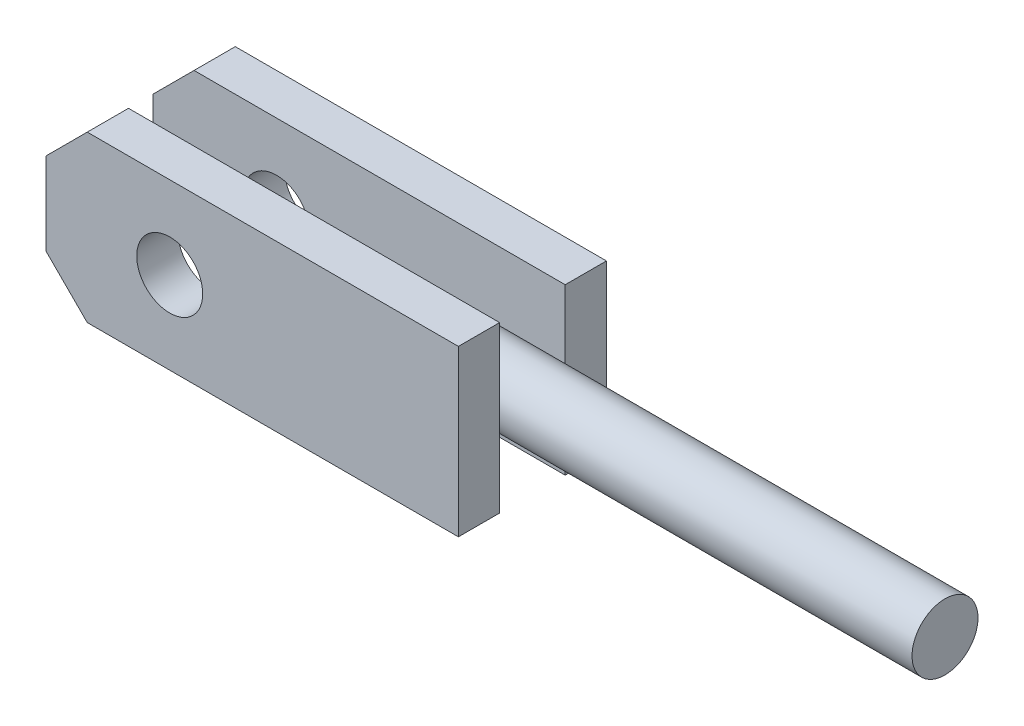
ISO-10303-21;
HEADER;
FILE_DESCRIPTION(('STEP AP214'),'2;1');
FILE_NAME('part.step','',(''),(''),'','','');
FILE_SCHEMA(('AUTOMOTIVE_DESIGN { 1 0 10303 214 1 1 1 1 }'));
ENDSEC;
DATA;
#1=APPLICATION_CONTEXT('core data for automotive mechanical design processes');
#2=APPLICATION_PROTOCOL_DEFINITION('international standard','automotive_design',2000,#1);
#3=PRODUCT_CONTEXT('',#1,'mechanical');
#4=PRODUCT('Part','Part','',(#3));
#5=PRODUCT_RELATED_PRODUCT_CATEGORY('part','',(#4));
#6=PRODUCT_DEFINITION_FORMATION('','',#4);
#7=PRODUCT_DEFINITION_CONTEXT('part definition',#1,'design');
#8=PRODUCT_DEFINITION('design','',#6,#7);
#9=PRODUCT_DEFINITION_SHAPE('','',#8);
#10=(LENGTH_UNIT() NAMED_UNIT(*) SI_UNIT(.MILLI.,.METRE.));
#11=(NAMED_UNIT(*) PLANE_ANGLE_UNIT() SI_UNIT($,.RADIAN.));
#12=(NAMED_UNIT(*) SI_UNIT($,.STERADIAN.) SOLID_ANGLE_UNIT());
#13=UNCERTAINTY_MEASURE_WITH_UNIT(LENGTH_MEASURE(1.E-05),#10,'distance_accuracy_value','');
#14=(GEOMETRIC_REPRESENTATION_CONTEXT(3) GLOBAL_UNCERTAINTY_ASSIGNED_CONTEXT((#13)) GLOBAL_UNIT_ASSIGNED_CONTEXT((#10,
#11,#12)) REPRESENTATION_CONTEXT('',''));
#15=CARTESIAN_POINT('',(0.,0.,0.));
#16=DIRECTION('',(0.,0.,1.));
#17=DIRECTION('',(1.,0.,0.));
#18=AXIS2_PLACEMENT_3D('',#15,#16,#17);
#19=CARTESIAN_POINT('',(30.0000000000008,-8.88178419700125E-13,-8.00000000000045));
#20=DIRECTION('',(1.,0.,0.));
#21=DIRECTION('',(0.,0.,-1.));
#22=AXIS2_PLACEMENT_3D('',#19,#20,#21);
#23=CYLINDRICAL_SURFACE('',#22,8.);
#24=DIRECTION('',(1.,0.,0.));
#25=VECTOR('',#24,1.);
#26=CARTESIAN_POINT('',(29.9999999999998,-1.26095202129184,-15.9000000000005));
#27=LINE('',#26,#25);
#28=CARTESIAN_POINT('',(50.0000000000002,-1.26095202129184,-15.9));
#29=VERTEX_POINT('',#28);
#30=CARTESIAN_POINT('',(29.9999999999998,-1.26095202129184,-15.9000000000005));
#31=VERTEX_POINT('',#30);
#32=EDGE_CURVE('E153',#29,#31,#27,.F.);
#33=ORIENTED_EDGE('',*,*,#32,.F.);
#34=CARTESIAN_POINT('',(50.0000000000003,4.44089209850063E-13,-7.9999999999999));
#35=DIRECTION('',(-1.,0.,0.));
#36=DIRECTION('',(0.,0.,1.));
#37=AXIS2_PLACEMENT_3D('',#34,#35,#36);
#38=CIRCLE('',#37,8.);
#39=CARTESIAN_POINT('',(49.9999999999994,1.26095202129006,-15.8999999999999));
#40=VERTEX_POINT('',#39);
#41=EDGE_CURVE('E134',#29,#40,#38,.F.);
#42=ORIENTED_EDGE('',*,*,#41,.T.);
#43=DIRECTION('',(1.,0.,0.));
#44=VECTOR('',#43,1.);
#45=CARTESIAN_POINT('',(29.9999999999993,1.26095202129184,-15.9000000000005));
#46=LINE('',#45,#44);
#47=CARTESIAN_POINT('',(29.9999999999993,1.26095202129184,-15.9000000000005));
#48=VERTEX_POINT('',#47);
#49=EDGE_CURVE('E128',#48,#40,#46,.T.);
#50=ORIENTED_EDGE('',*,*,#49,.F.);
#51=CARTESIAN_POINT('',(30.0000000000008,-8.88178419700125E-13,-8.00000000000045));
#52=DIRECTION('',(1.,0.,0.));
#53=DIRECTION('',(0.,0.,-1.));
#54=AXIS2_PLACEMENT_3D('',#51,#52,#53);
#55=CIRCLE('',#54,8.);
#56=EDGE_CURVE('E158',#48,#31,#55,.T.);
#57=ORIENTED_EDGE('',*,*,#56,.T.);
#58=EDGE_LOOP('',(#33,#42,#50,#57));
#59=FACE_BOUND('',#58,.T.);
#60=CARTESIAN_POINT('',(149.999999999998,-3.10862446895044E-12,-8.00000000000045));
#61=DIRECTION('',(1.,0.,0.));
#62=DIRECTION('',(0.,0.,-1.));
#63=AXIS2_PLACEMENT_3D('',#60,#61,#62);
#64=CIRCLE('',#63,8.);
#65=CARTESIAN_POINT('',(149.999999999998,-3.1141131260501E-12,-16.0000000000005));
#66=VERTEX_POINT('',#65);
#67=EDGE_CURVE('E155',#66,#66,#64,.T.);
#68=ORIENTED_EDGE('',*,*,#67,.F.);
#69=EDGE_LOOP('',(#68));
#70=FACE_BOUND('',#69,.T.);
#71=ADVANCED_FACE('F44',(#59,#70),#23,.T.);
#72=CARTESIAN_POINT('',(30.0000000000008,-8.88178419700125E-13,-8.00000000000045));
#73=DIRECTION('',(1.,0.,0.));
#74=DIRECTION('',(0.,0.,-1.));
#75=AXIS2_PLACEMENT_3D('',#72,#73,#74);
#76=PLANE('',#75);
#77=ORIENTED_EDGE('',*,*,#56,.F.);
#78=DIRECTION('',(0.,-1.,0.));
#79=VECTOR('',#78,1.);
#80=CARTESIAN_POINT('',(30.0000000000016,-4.44089209850063E-13,-15.9000000000005));
#81=LINE('',#80,#79);
#82=EDGE_CURVE('E161',#48,#31,#81,.T.);
#83=ORIENTED_EDGE('',*,*,#82,.T.);
#84=EDGE_LOOP('',(#77,#83));
#85=FACE_BOUND('',#84,.T.);
#86=ADVANCED_FACE('F208',(#85),#76,.F.);
#87=CARTESIAN_POINT('',(149.999999999998,-3.10862446895044E-12,-8.00000000000045));
#88=DIRECTION('',(1.,0.,0.));
#89=DIRECTION('',(0.,0.,-1.));
#90=AXIS2_PLACEMENT_3D('',#87,#88,#89);
#91=PLANE('',#90);
#92=ORIENTED_EDGE('',*,*,#67,.T.);
#93=EDGE_LOOP('',(#92));
#94=FACE_BOUND('',#93,.T.);
#95=ADVANCED_FACE('F214',(#94),#91,.T.);
#96=CARTESIAN_POINT('',(-49.9999999999989,-20.,-15.9000000000008));
#97=DIRECTION('',(1.,0.,0.));
#98=DIRECTION('',(0.,1.,0.));
#99=AXIS2_PLACEMENT_3D('',#96,#97,#98);
#100=PLANE('',#99);
#101=DIRECTION('',(0.,-1.,0.));
#102=VECTOR('',#101,1.);
#103=CARTESIAN_POINT('',(-50.0000000000003,-20.0000000000014,-25.9000000000008));
#104=LINE('',#103,#102);
#105=CARTESIAN_POINT('',(-49.9999999999995,9.99999999999801,-25.9000000000007));
#106=VERTEX_POINT('',#105);
#107=CARTESIAN_POINT('',(-49.9999999999998,-9.99999999999979,-25.9000000000005));
#108=VERTEX_POINT('',#107);
#109=EDGE_CURVE('E141',#106,#108,#104,.T.);
#110=ORIENTED_EDGE('',*,*,#109,.T.);
#111=DIRECTION('',(0.,0.,1.));
#112=VECTOR('',#111,1.);
#113=CARTESIAN_POINT('',(-49.9999999999998,-10.0000000000011,-15.9000000000005));
#114=LINE('',#113,#112);
#115=CARTESIAN_POINT('',(-49.9999999999998,-10.0000000000011,-15.9000000000005));
#116=VERTEX_POINT('',#115);
#117=EDGE_CURVE('E52',#108,#116,#114,.T.);
#118=ORIENTED_EDGE('',*,*,#117,.T.);
#119=DIRECTION('',(0.,-1.,0.));
#120=VECTOR('',#119,1.);
#121=CARTESIAN_POINT('',(-49.9999999999989,-20.,-15.9000000000008));
#122=LINE('',#121,#120);
#123=CARTESIAN_POINT('',(-50.0000000000012,9.99999999999934,-15.9000000000007));
#124=VERTEX_POINT('',#123);
#125=EDGE_CURVE('E120',#124,#116,#122,.T.);
#126=ORIENTED_EDGE('',*,*,#125,.F.);
#127=DIRECTION('',(0.,0.,-1.));
#128=VECTOR('',#127,1.);
#129=CARTESIAN_POINT('',(-50.0000000000012,9.99999999999934,-15.9000000000007));
#130=LINE('',#129,#128);
#131=EDGE_CURVE('E165',#124,#106,#130,.T.);
#132=ORIENTED_EDGE('',*,*,#131,.T.);
#133=EDGE_LOOP('',(#110,#118,#126,#132));
#134=FACE_BOUND('',#133,.T.);
#135=ADVANCED_FACE('F188',(#134),#100,.F.);
#136=CARTESIAN_POINT('',(50.0000000000003,-20.0000000000009,-15.9000000000004));
#137=DIRECTION('',(0.,1.,0.));
#138=DIRECTION('',(-1.,0.,0.));
#139=AXIS2_PLACEMENT_3D('',#136,#137,#138);
#140=PLANE('',#139);
#141=DIRECTION('',(1.,0.,0.));
#142=VECTOR('',#141,1.);
#143=CARTESIAN_POINT('',(50.0000000000003,-20.0000000000009,-15.9000000000004));
#144=LINE('',#143,#142);
#145=CARTESIAN_POINT('',(-40.0000000000014,-20.0000000000018,-15.9000000000005));
#146=VERTEX_POINT('',#145);
#147=CARTESIAN_POINT('',(50.0000000000003,-20.0000000000009,-15.9000000000004));
#148=VERTEX_POINT('',#147);
#149=EDGE_CURVE('E109',#146,#148,#144,.T.);
#150=ORIENTED_EDGE('',*,*,#149,.F.);
#151=DIRECTION('',(0.,0.,-1.));
#152=VECTOR('',#151,1.);
#153=CARTESIAN_POINT('',(-40.0000000000014,-20.0000000000018,-15.9000000000005));
#154=LINE('',#153,#152);
#155=CARTESIAN_POINT('',(-40.0000000000005,-20.0000000000031,-25.9000000000005));
#156=VERTEX_POINT('',#155);
#157=EDGE_CURVE('E174',#146,#156,#154,.T.);
#158=ORIENTED_EDGE('',*,*,#157,.T.);
#159=DIRECTION('',(1.,0.,0.));
#160=VECTOR('',#159,1.);
#161=CARTESIAN_POINT('',(50.0000000000003,-20.0000000000009,-25.9000000000004));
#162=LINE('',#161,#160);
#163=CARTESIAN_POINT('',(50.0000000000003,-20.0000000000009,-25.9000000000004));
#164=VERTEX_POINT('',#163);
#165=EDGE_CURVE('E125',#156,#164,#162,.T.);
#166=ORIENTED_EDGE('',*,*,#165,.T.);
#167=DIRECTION('',(0.,0.,-1.));
#168=VECTOR('',#167,1.);
#169=CARTESIAN_POINT('',(50.0000000000003,-20.0000000000009,-15.9000000000004));
#170=LINE('',#169,#168);
#171=EDGE_CURVE('E123',#148,#164,#170,.T.);
#172=ORIENTED_EDGE('',*,*,#171,.F.);
#173=EDGE_LOOP('',(#150,#158,#166,#172));
#174=FACE_BOUND('',#173,.T.);
#175=ADVANCED_FACE('F124',(#174),#140,.F.);
#176=CARTESIAN_POINT('',(50.0000000000003,-20.0000000000009,-15.9000000000004));
#177=DIRECTION('',(-1.,0.,0.));
#178=DIRECTION('',(0.,0.,1.));
#179=AXIS2_PLACEMENT_3D('',#176,#177,#178);
#180=PLANE('',#179);
#181=ORIENTED_EDGE('',*,*,#41,.F.);
#182=DIRECTION('',(0.,1.,0.));
#183=VECTOR('',#182,1.);
#184=CARTESIAN_POINT('',(50.0000000000003,-20.0000000000009,-15.9000000000004));
#185=LINE('',#184,#183);
#186=EDGE_CURVE('E113',#148,#29,#185,.T.);
#187=ORIENTED_EDGE('',*,*,#186,.F.);
#188=ORIENTED_EDGE('',*,*,#171,.T.);
#189=DIRECTION('',(0.,1.,0.));
#190=VECTOR('',#189,1.);
#191=CARTESIAN_POINT('',(50.0000000000003,-20.0000000000009,-25.9000000000004));
#192=LINE('',#191,#190);
#193=CARTESIAN_POINT('',(49.9999999999994,19.9999999999991,-25.9000000000001));
#194=VERTEX_POINT('',#193);
#195=EDGE_CURVE('E145',#164,#194,#192,.T.);
#196=ORIENTED_EDGE('',*,*,#195,.T.);
#197=DIRECTION('',(0.,0.,-1.));
#198=VECTOR('',#197,1.);
#199=CARTESIAN_POINT('',(49.9999999999997,19.9999999999991,-15.9000000000001));
#200=LINE('',#199,#198);
#201=CARTESIAN_POINT('',(49.9999999999997,19.9999999999991,-15.9000000000001));
#202=VERTEX_POINT('',#201);
#203=EDGE_CURVE('E129',#202,#194,#200,.T.);
#204=ORIENTED_EDGE('',*,*,#203,.F.);
#205=EDGE_CURVE('E119',#40,#202,#185,.T.);
#206=ORIENTED_EDGE('',*,*,#205,.F.);
#207=EDGE_LOOP('',(#181,#187,#188,#196,#204,#206));
#208=FACE_BOUND('',#207,.T.);
#209=ADVANCED_FACE('F131',(#208),#180,.F.);
#210=CARTESIAN_POINT('',(49.9999999999997,19.9999999999991,-15.9000000000001));
#211=DIRECTION('',(0.,-1.,0.));
#212=DIRECTION('',(1.,0.,0.));
#213=AXIS2_PLACEMENT_3D('',#210,#211,#212);
#214=PLANE('',#213);
#215=DIRECTION('',(-1.,0.,0.));
#216=VECTOR('',#215,1.);
#217=CARTESIAN_POINT('',(49.9999999999994,19.9999999999991,-25.9000000000001));
#218=LINE('',#217,#216);
#219=CARTESIAN_POINT('',(-40.0000000000009,20.,-25.9000000000007));
#220=VERTEX_POINT('',#219);
#221=EDGE_CURVE('E147',#194,#220,#218,.T.);
#222=ORIENTED_EDGE('',*,*,#221,.T.);
#223=DIRECTION('',(0.,0.,1.));
#224=VECTOR('',#223,1.);
#225=CARTESIAN_POINT('',(-40.0000000000005,19.9999999999991,-15.9000000000007));
#226=LINE('',#225,#224);
#227=CARTESIAN_POINT('',(-40.0000000000005,19.9999999999991,-15.9000000000007));
#228=VERTEX_POINT('',#227);
#229=EDGE_CURVE('E170',#220,#228,#226,.T.);
#230=ORIENTED_EDGE('',*,*,#229,.T.);
#231=DIRECTION('',(-1.,0.,0.));
#232=VECTOR('',#231,1.);
#233=CARTESIAN_POINT('',(49.9999999999997,19.9999999999991,-15.9000000000001));
#234=LINE('',#233,#232);
#235=EDGE_CURVE('E135',#202,#228,#234,.T.);
#236=ORIENTED_EDGE('',*,*,#235,.F.);
#237=ORIENTED_EDGE('',*,*,#203,.T.);
#238=EDGE_LOOP('',(#222,#230,#236,#237));
#239=FACE_BOUND('',#238,.T.);
#240=ADVANCED_FACE('F182',(#239),#214,.F.);
#241=CARTESIAN_POINT('',(0.,0.,-15.9));
#242=DIRECTION('',(0.,0.,1.));
#243=DIRECTION('',(1.,0.,0.));
#244=AXIS2_PLACEMENT_3D('',#241,#242,#243);
#245=PLANE('',#244);
#246=CARTESIAN_POINT('',(-20.0000000000001,-1.77635683940025E-12,-15.9));
#247=DIRECTION('',(0.,0.,1.));
#248=DIRECTION('',(1.,0.,0.));
#249=AXIS2_PLACEMENT_3D('',#246,#247,#248);
#250=CIRCLE('',#249,8.);
#251=CARTESIAN_POINT('',(-12.0000000000001,-1.7768009286101E-12,-15.9));
#252=VERTEX_POINT('',#251);
#253=EDGE_CURVE('E143',#252,#252,#250,.T.);
#254=ORIENTED_EDGE('',*,*,#253,.F.);
#255=EDGE_LOOP('',(#254));
#256=FACE_BOUND('',#255,.T.);
#257=ORIENTED_EDGE('',*,*,#125,.T.);
#258=DIRECTION('',(-0.707106781186548,0.707106781186552,0.));
#259=VECTOR('',#258,1.);
#260=CARTESIAN_POINT('',(-29.9999999999998,-29.9999999999994,-15.9000000000008));
#261=LINE('',#260,#259);
#262=EDGE_CURVE('E12',#116,#146,#261,.F.);
#263=ORIENTED_EDGE('',*,*,#262,.T.);
#264=ORIENTED_EDGE('',*,*,#149,.T.);
#265=ORIENTED_EDGE('',*,*,#186,.T.);
#266=ORIENTED_EDGE('',*,*,#32,.T.);
#267=ORIENTED_EDGE('',*,*,#82,.F.);
#268=ORIENTED_EDGE('',*,*,#49,.T.);
#269=ORIENTED_EDGE('',*,*,#205,.T.);
#270=ORIENTED_EDGE('',*,*,#235,.T.);
#271=DIRECTION('',(0.707106781186549,0.707106781186549,0.));
#272=VECTOR('',#271,1.);
#273=CARTESIAN_POINT('',(-30.0000000000007,29.9999999999994,-15.9000000000009));
#274=LINE('',#273,#272);
#275=EDGE_CURVE('E172',#228,#124,#274,.F.);
#276=ORIENTED_EDGE('',*,*,#275,.T.);
#277=EDGE_LOOP('',(#257,#263,#264,#265,#266,#267,#268,#269,#270,#276));
#278=FACE_BOUND('',#277,.T.);
#279=ADVANCED_FACE('F111',(#256,#278),#245,.T.);
#280=CARTESIAN_POINT('',(4.44089209850063E-13,8.88178419700125E-13,-25.9));
#281=DIRECTION('',(0.,0.,1.));
#282=DIRECTION('',(1.,0.,0.));
#283=AXIS2_PLACEMENT_3D('',#280,#281,#282);
#284=PLANE('',#283);
#285=CARTESIAN_POINT('',(-19.9999999999987,-8.88178419700125E-13,-25.9));
#286=DIRECTION('',(0.,0.,-1.));
#287=DIRECTION('',(-1.,0.,0.));
#288=AXIS2_PLACEMENT_3D('',#285,#286,#287);
#289=CIRCLE('',#288,8.);
#290=CARTESIAN_POINT('',(-27.9999999999987,-8.87734330490275E-13,-25.9));
#291=VERTEX_POINT('',#290);
#292=EDGE_CURVE('E192',#291,#291,#289,.T.);
#293=ORIENTED_EDGE('',*,*,#292,.F.);
#294=EDGE_LOOP('',(#293));
#295=FACE_BOUND('',#294,.T.);
#296=ORIENTED_EDGE('',*,*,#165,.F.);
#297=DIRECTION('',(0.707106781186548,-0.707106781186552,0.));
#298=VECTOR('',#297,1.);
#299=CARTESIAN_POINT('',(-40.0000000000005,-20.0000000000031,-25.9000000000005));
#300=LINE('',#299,#298);
#301=EDGE_CURVE('E66',#156,#108,#300,.F.);
#302=ORIENTED_EDGE('',*,*,#301,.T.);
#303=ORIENTED_EDGE('',*,*,#109,.F.);
#304=DIRECTION('',(-0.707106781186549,-0.707106781186549,0.));
#305=VECTOR('',#304,1.);
#306=CARTESIAN_POINT('',(-49.9999999999995,9.99999999999801,-25.9000000000007));
#307=LINE('',#306,#305);
#308=EDGE_CURVE('E168',#106,#220,#307,.F.);
#309=ORIENTED_EDGE('',*,*,#308,.T.);
#310=ORIENTED_EDGE('',*,*,#221,.F.);
#311=ORIENTED_EDGE('',*,*,#195,.F.);
#312=EDGE_LOOP('',(#296,#302,#303,#309,#310,#311));
#313=FACE_BOUND('',#312,.T.);
#314=ADVANCED_FACE('F177',(#295,#313),#284,.F.);
#315=CARTESIAN_POINT('',(-50.0000000000012,9.99999999999934,-15.9000000000007));
#316=DIRECTION('',(0.707106781186548,-0.707106781186551,0.));
#317=DIRECTION('',(0.,0.,-1.));
#318=AXIS2_PLACEMENT_3D('',#315,#316,#317);
#319=PLANE('',#318);
#320=ORIENTED_EDGE('',*,*,#275,.F.);
#321=ORIENTED_EDGE('',*,*,#229,.F.);
#322=ORIENTED_EDGE('',*,*,#308,.F.);
#323=ORIENTED_EDGE('',*,*,#131,.F.);
#324=EDGE_LOOP('',(#320,#321,#322,#323));
#325=FACE_BOUND('',#324,.T.);
#326=ADVANCED_FACE('F187',(#325),#319,.F.);
#327=CARTESIAN_POINT('',(-40.0000000000014,-20.0000000000018,-15.9000000000005));
#328=DIRECTION('',(0.707106781186549,0.707106781186549,0.));
#329=DIRECTION('',(0.,0.,-1.));
#330=AXIS2_PLACEMENT_3D('',#327,#328,#329);
#331=PLANE('',#330);
#332=ORIENTED_EDGE('',*,*,#262,.F.);
#333=ORIENTED_EDGE('',*,*,#117,.F.);
#334=ORIENTED_EDGE('',*,*,#301,.F.);
#335=ORIENTED_EDGE('',*,*,#157,.F.);
#336=EDGE_LOOP('',(#332,#333,#334,#335));
#337=FACE_BOUND('',#336,.T.);
#338=ADVANCED_FACE('F46',(#337),#331,.F.);
#339=CARTESIAN_POINT('',(-19.9999999999991,-1.33226762955019E-12,74.1000000000001));
#340=DIRECTION('',(0.,0.,-1.));
#341=DIRECTION('',(-1.,0.,0.));
#342=AXIS2_PLACEMENT_3D('',#339,#340,#341);
#343=CYLINDRICAL_SURFACE('',#342,8.);
#344=ORIENTED_EDGE('',*,*,#253,.T.);
#345=EDGE_LOOP('',(#344));
#346=FACE_BOUND('',#345,.T.);
#347=ORIENTED_EDGE('',*,*,#292,.T.);
#348=EDGE_LOOP('',(#347));
#349=FACE_BOUND('',#348,.T.);
#350=ADVANCED_FACE('F196',(#346,#349),#343,.F.);
#351=CLOSED_SHELL('',(#71,#86,#95,#135,#175,#209,#240,#279,#314,#326,#338,#350));
#352=MANIFOLD_SOLID_BREP('B2',#351);
#353=CARTESIAN_POINT('',(-49.9999999999994,-20.,9.99999999999923));
#354=DIRECTION('',(1.,0.,0.));
#355=DIRECTION('',(0.,1.,0.));
#356=AXIS2_PLACEMENT_3D('',#353,#354,#355);
#357=PLANE('',#356);
#358=DIRECTION('',(0.,-1.,0.));
#359=VECTOR('',#358,1.);
#360=CARTESIAN_POINT('',(-49.9999999999994,-20.0000000000007,-6.66133814775094E-13));
#361=LINE('',#360,#359);
#362=CARTESIAN_POINT('',(-49.9999999999989,9.99999999999801,-6.66133814775094E-13));
#363=VERTEX_POINT('',#362);
#364=CARTESIAN_POINT('',(-49.9999999999998,-9.99999999999934,-5.55111512312578E-13));
#365=VERTEX_POINT('',#364);
#366=EDGE_CURVE('E388',#363,#365,#361,.T.);
#367=ORIENTED_EDGE('',*,*,#366,.T.);
#368=DIRECTION('',(0.,0.,1.));
#369=VECTOR('',#368,1.);
#370=CARTESIAN_POINT('',(-49.9999999999998,-10.0000000000002,9.99999999999956));
#371=LINE('',#370,#369);
#372=CARTESIAN_POINT('',(-49.9999999999998,-10.0000000000002,9.99999999999956));
#373=VERTEX_POINT('',#372);
#374=EDGE_CURVE('E314',#365,#373,#371,.T.);
#375=ORIENTED_EDGE('',*,*,#374,.T.);
#376=DIRECTION('',(0.,-1.,0.));
#377=VECTOR('',#376,1.);
#378=CARTESIAN_POINT('',(-49.9999999999994,-20.,9.99999999999923));
#379=LINE('',#378,#377);
#380=CARTESIAN_POINT('',(-49.9999999999989,9.99999999999845,9.99999999999923));
#381=VERTEX_POINT('',#380);
#382=EDGE_CURVE('E369',#381,#373,#379,.T.);
#383=ORIENTED_EDGE('',*,*,#382,.F.);
#384=DIRECTION('',(0.,0.,-1.));
#385=VECTOR('',#384,1.);
#386=CARTESIAN_POINT('',(-49.9999999999989,9.99999999999845,9.99999999999923));
#387=LINE('',#386,#385);
#388=EDGE_CURVE('E377',#381,#363,#387,.T.);
#389=ORIENTED_EDGE('',*,*,#388,.T.);
#390=EDGE_LOOP('',(#367,#375,#383,#389));
#391=FACE_BOUND('',#390,.T.);
#392=ADVANCED_FACE('F306',(#391),#357,.F.);
#393=CARTESIAN_POINT('',(50.0000000000016,-20.0000000000005,9.99999999999979));
#394=DIRECTION('',(0.,1.,0.));
#395=DIRECTION('',(-1.,0.,0.));
#396=AXIS2_PLACEMENT_3D('',#393,#394,#395);
#397=PLANE('',#396);
#398=DIRECTION('',(1.,0.,0.));
#399=VECTOR('',#398,1.);
#400=CARTESIAN_POINT('',(50.0000000000016,-20.0000000000005,9.99999999999979));
#401=LINE('',#400,#399);
#402=CARTESIAN_POINT('',(-39.9999999999996,-20.000000000002,9.99999999999956));
#403=VERTEX_POINT('',#402);
#404=CARTESIAN_POINT('',(50.0000000000016,-20.0000000000005,9.99999999999979));
#405=VERTEX_POINT('',#404);
#406=EDGE_CURVE('E358',#403,#405,#401,.T.);
#407=ORIENTED_EDGE('',*,*,#406,.F.);
#408=DIRECTION('',(0.,0.,-1.));
#409=VECTOR('',#408,1.);
#410=CARTESIAN_POINT('',(-39.9999999999996,-20.000000000002,9.99999999999956));
#411=LINE('',#410,#409);
#412=CARTESIAN_POINT('',(-39.9999999999991,-20.0000000000027,-4.44089209850063E-13));
#413=VERTEX_POINT('',#412);
#414=EDGE_CURVE('E406',#403,#413,#411,.T.);
#415=ORIENTED_EDGE('',*,*,#414,.T.);
#416=DIRECTION('',(1.,0.,0.));
#417=VECTOR('',#416,1.);
#418=CARTESIAN_POINT('',(50.0000000000007,-20.0000000000005,-2.22044604925031E-13));
#419=LINE('',#418,#417);
#420=CARTESIAN_POINT('',(50.0000000000007,-20.0000000000005,-2.22044604925031E-13));
#421=VERTEX_POINT('',#420);
#422=EDGE_CURVE('E374',#413,#421,#419,.T.);
#423=ORIENTED_EDGE('',*,*,#422,.T.);
#424=DIRECTION('',(0.,0.,-1.));
#425=VECTOR('',#424,1.);
#426=CARTESIAN_POINT('',(50.0000000000016,-20.0000000000005,9.99999999999979));
#427=LINE('',#426,#425);
#428=EDGE_CURVE('E372',#405,#421,#427,.T.);
#429=ORIENTED_EDGE('',*,*,#428,.F.);
#430=EDGE_LOOP('',(#407,#415,#423,#429));
#431=FACE_BOUND('',#430,.T.);
#432=ADVANCED_FACE('F373',(#431),#397,.F.);
#433=CARTESIAN_POINT('',(50.0000000000016,-20.0000000000005,9.99999999999979));
#434=DIRECTION('',(-1.,0.,0.));
#435=DIRECTION('',(0.,0.,1.));
#436=AXIS2_PLACEMENT_3D('',#433,#434,#435);
#437=PLANE('',#436);
#438=DIRECTION('',(0.,1.,0.));
#439=VECTOR('',#438,1.);
#440=CARTESIAN_POINT('',(50.0000000000007,-20.0000000000005,-2.22044604925031E-13));
#441=LINE('',#440,#439);
#442=CARTESIAN_POINT('',(49.9999999999998,19.9999999999998,-2.22044604925031E-13));
#443=VERTEX_POINT('',#442);
#444=EDGE_CURVE('E392',#421,#443,#441,.T.);
#445=ORIENTED_EDGE('',*,*,#444,.T.);
#446=DIRECTION('',(0.,0.,-1.));
#447=VECTOR('',#446,1.);
#448=CARTESIAN_POINT('',(49.9999999999998,19.9999999999996,9.9999999999999));
#449=LINE('',#448,#447);
#450=CARTESIAN_POINT('',(49.9999999999998,19.9999999999996,9.9999999999999));
#451=VERTEX_POINT('',#450);
#452=EDGE_CURVE('E378',#451,#443,#449,.T.);
#453=ORIENTED_EDGE('',*,*,#452,.F.);
#454=DIRECTION('',(0.,1.,0.));
#455=VECTOR('',#454,1.);
#456=CARTESIAN_POINT('',(50.0000000000016,-20.0000000000005,9.99999999999979));
#457=LINE('',#456,#455);
#458=EDGE_CURVE('E363',#405,#451,#457,.T.);
#459=ORIENTED_EDGE('',*,*,#458,.F.);
#460=ORIENTED_EDGE('',*,*,#428,.T.);
#461=EDGE_LOOP('',(#445,#453,#459,#460));
#462=FACE_BOUND('',#461,.T.);
#463=ADVANCED_FACE('F380',(#462),#437,.F.);
#464=CARTESIAN_POINT('',(49.9999999999998,19.9999999999996,9.9999999999999));
#465=DIRECTION('',(0.,-1.,0.));
#466=DIRECTION('',(1.,0.,0.));
#467=AXIS2_PLACEMENT_3D('',#464,#465,#466);
#468=PLANE('',#467);
#469=DIRECTION('',(-1.,0.,0.));
#470=VECTOR('',#469,1.);
#471=CARTESIAN_POINT('',(49.9999999999998,19.9999999999998,-2.22044604925031E-13));
#472=LINE('',#471,#470);
#473=CARTESIAN_POINT('',(-40.0000000000005,19.999999999998,-6.66133814775094E-13));
#474=VERTEX_POINT('',#473);
#475=EDGE_CURVE('E394',#443,#474,#472,.T.);
#476=ORIENTED_EDGE('',*,*,#475,.T.);
#477=DIRECTION('',(0.,0.,1.));
#478=VECTOR('',#477,1.);
#479=CARTESIAN_POINT('',(-40.0000000000014,19.9999999999974,9.99999999999945));
#480=LINE('',#479,#478);
#481=CARTESIAN_POINT('',(-40.0000000000014,19.9999999999974,9.99999999999945));
#482=VERTEX_POINT('',#481);
#483=EDGE_CURVE('E402',#474,#482,#480,.T.);
#484=ORIENTED_EDGE('',*,*,#483,.T.);
#485=DIRECTION('',(-1.,0.,0.));
#486=VECTOR('',#485,1.);
#487=CARTESIAN_POINT('',(49.9999999999998,19.9999999999996,9.9999999999999));
#488=LINE('',#487,#486);
#489=EDGE_CURVE('E383',#451,#482,#488,.T.);
#490=ORIENTED_EDGE('',*,*,#489,.F.);
#491=ORIENTED_EDGE('',*,*,#452,.T.);
#492=EDGE_LOOP('',(#476,#484,#490,#491));
#493=FACE_BOUND('',#492,.T.);
#494=ADVANCED_FACE('F412',(#493),#468,.F.);
#495=CARTESIAN_POINT('',(4.44089209850063E-13,-8.88178419700125E-13,10.));
#496=DIRECTION('',(0.,0.,1.));
#497=DIRECTION('',(1.,0.,0.));
#498=AXIS2_PLACEMENT_3D('',#495,#496,#497);
#499=PLANE('',#498);
#500=CARTESIAN_POINT('',(-19.9999999999982,-1.77635683940025E-12,10.));
#501=DIRECTION('',(0.,0.,1.));
#502=DIRECTION('',(1.,0.,0.));
#503=AXIS2_PLACEMENT_3D('',#500,#501,#502);
#504=CIRCLE('',#503,8.);
#505=CARTESIAN_POINT('',(-11.9999999999982,-1.7768009286101E-12,10.));
#506=VERTEX_POINT('',#505);
#507=EDGE_CURVE('E419',#506,#506,#504,.T.);
#508=ORIENTED_EDGE('',*,*,#507,.F.);
#509=EDGE_LOOP('',(#508));
#510=FACE_BOUND('',#509,.T.);
#511=ORIENTED_EDGE('',*,*,#382,.T.);
#512=DIRECTION('',(-0.707106781186547,0.707106781186552,0.));
#513=VECTOR('',#512,1.);
#514=CARTESIAN_POINT('',(-29.9999999999989,-30.0000000000025,9.99999999999934));
#515=LINE('',#514,#513);
#516=EDGE_CURVE('E42',#373,#403,#515,.F.);
#517=ORIENTED_EDGE('',*,*,#516,.T.);
#518=ORIENTED_EDGE('',*,*,#406,.T.);
#519=ORIENTED_EDGE('',*,*,#458,.T.);
#520=ORIENTED_EDGE('',*,*,#489,.T.);
#521=DIRECTION('',(0.70710678118655,0.707106781186548,0.));
#522=VECTOR('',#521,1.);
#523=CARTESIAN_POINT('',(-29.9999999999994,29.999999999998,9.99999999999912));
#524=LINE('',#523,#522);
#525=EDGE_CURVE('E404',#482,#381,#524,.F.);
#526=ORIENTED_EDGE('',*,*,#525,.T.);
#527=EDGE_LOOP('',(#511,#517,#518,#519,#520,#526));
#528=FACE_BOUND('',#527,.T.);
#529=ADVANCED_FACE('F360',(#510,#528),#499,.T.);
#530=CARTESIAN_POINT('',(0.,0.,0.));
#531=DIRECTION('',(0.,0.,1.));
#532=DIRECTION('',(1.,0.,0.));
#533=AXIS2_PLACEMENT_3D('',#530,#531,#532);
#534=PLANE('',#533);
#535=CARTESIAN_POINT('',(-19.9999999999991,-8.88178419700125E-13,0.));
#536=DIRECTION('',(0.,0.,1.));
#537=DIRECTION('',(1.,0.,0.));
#538=AXIS2_PLACEMENT_3D('',#535,#536,#537);
#539=CIRCLE('',#538,8.);
#540=CARTESIAN_POINT('',(-11.9999999999991,-8.88622508909975E-13,0.));
#541=VERTEX_POINT('',#540);
#542=EDGE_CURVE('E390',#541,#541,#539,.T.);
#543=ORIENTED_EDGE('',*,*,#542,.T.);
#544=EDGE_LOOP('',(#543));
#545=FACE_BOUND('',#544,.T.);
#546=ORIENTED_EDGE('',*,*,#422,.F.);
#547=DIRECTION('',(0.707106781186547,-0.707106781186552,0.));
#548=VECTOR('',#547,1.);
#549=CARTESIAN_POINT('',(-39.9999999999991,-20.0000000000027,-4.44089209850063E-13));
#550=LINE('',#549,#548);
#551=EDGE_CURVE('E328',#413,#365,#550,.F.);
#552=ORIENTED_EDGE('',*,*,#551,.T.);
#553=ORIENTED_EDGE('',*,*,#366,.F.);
#554=DIRECTION('',(-0.70710678118655,-0.707106781186548,0.));
#555=VECTOR('',#554,1.);
#556=CARTESIAN_POINT('',(-49.9999999999989,9.99999999999801,-6.66133814775094E-13));
#557=LINE('',#556,#555);
#558=EDGE_CURVE('E400',#363,#474,#557,.F.);
#559=ORIENTED_EDGE('',*,*,#558,.T.);
#560=ORIENTED_EDGE('',*,*,#475,.F.);
#561=ORIENTED_EDGE('',*,*,#444,.F.);
#562=EDGE_LOOP('',(#546,#552,#553,#559,#560,#561));
#563=FACE_BOUND('',#562,.T.);
#564=ADVANCED_FACE('F409',(#545,#563),#534,.F.);
#565=CARTESIAN_POINT('',(-19.9999999999991,-8.88178419700125E-13,0.));
#566=DIRECTION('',(0.,0.,1.));
#567=DIRECTION('',(1.,0.,0.));
#568=AXIS2_PLACEMENT_3D('',#565,#566,#567);
#569=CYLINDRICAL_SURFACE('',#568,8.);
#570=ORIENTED_EDGE('',*,*,#542,.F.);
#571=EDGE_LOOP('',(#570));
#572=FACE_BOUND('',#571,.T.);
#573=ORIENTED_EDGE('',*,*,#507,.T.);
#574=EDGE_LOOP('',(#573));
#575=FACE_BOUND('',#574,.T.);
#576=ADVANCED_FACE('F426',(#572,#575),#569,.F.);
#577=CARTESIAN_POINT('',(-49.9999999999989,9.99999999999845,9.99999999999923));
#578=DIRECTION('',(0.707106781186547,-0.707106781186552,0.));
#579=DIRECTION('',(0.,0.,-1.));
#580=AXIS2_PLACEMENT_3D('',#577,#578,#579);
#581=PLANE('',#580);
#582=ORIENTED_EDGE('',*,*,#525,.F.);
#583=ORIENTED_EDGE('',*,*,#483,.F.);
#584=ORIENTED_EDGE('',*,*,#558,.F.);
#585=ORIENTED_EDGE('',*,*,#388,.F.);
#586=EDGE_LOOP('',(#582,#583,#584,#585));
#587=FACE_BOUND('',#586,.T.);
#588=ADVANCED_FACE('F417',(#587),#581,.F.);
#589=CARTESIAN_POINT('',(-39.9999999999996,-20.000000000002,9.99999999999956));
#590=DIRECTION('',(0.70710678118655,0.707106781186549,0.));
#591=DIRECTION('',(0.,0.,-1.));
#592=AXIS2_PLACEMENT_3D('',#589,#590,#591);
#593=PLANE('',#592);
#594=ORIENTED_EDGE('',*,*,#516,.F.);
#595=ORIENTED_EDGE('',*,*,#374,.F.);
#596=ORIENTED_EDGE('',*,*,#551,.F.);
#597=ORIENTED_EDGE('',*,*,#414,.F.);
#598=EDGE_LOOP('',(#594,#595,#596,#597));
#599=FACE_BOUND('',#598,.T.);
#600=ADVANCED_FACE('F308',(#599),#593,.F.);
#601=CLOSED_SHELL('',(#392,#432,#463,#494,#529,#564,#576,#588,#600));
#602=MANIFOLD_SOLID_BREP('B6',#601);
#603=ADVANCED_BREP_SHAPE_REPRESENTATION('',(#18,#352,#602),#14);
#604=SHAPE_DEFINITION_REPRESENTATION(#9,#603);
ENDSEC;
END-ISO-10303-21;
